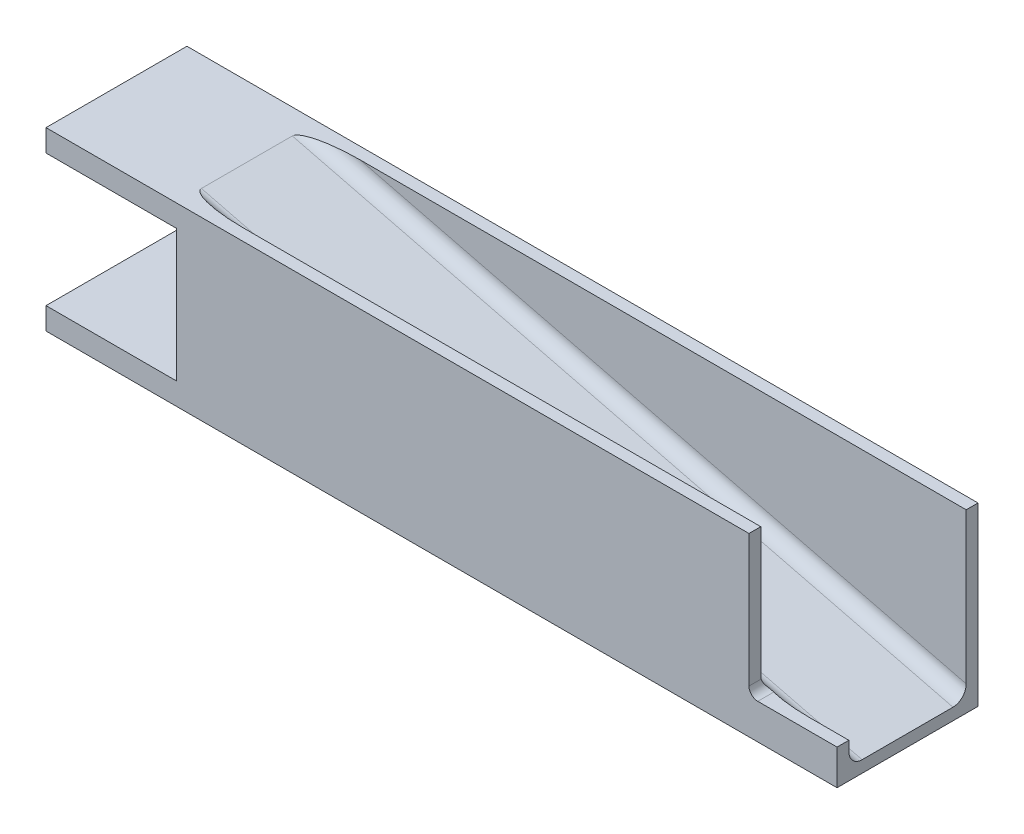
ISO-10303-21;
HEADER;
FILE_DESCRIPTION(('STEP AP214'),'2;1');
FILE_NAME('part.step','',(''),(''),'','','');
FILE_SCHEMA(('AUTOMOTIVE_DESIGN { 1 0 10303 214 1 1 1 1 }'));
ENDSEC;
DATA;
#1=APPLICATION_CONTEXT('core data for automotive mechanical design processes');
#2=APPLICATION_PROTOCOL_DEFINITION('international standard','automotive_design',2000,#1);
#3=PRODUCT_CONTEXT('',#1,'mechanical');
#4=PRODUCT('Part','Part','',(#3));
#5=PRODUCT_RELATED_PRODUCT_CATEGORY('part','',(#4));
#6=PRODUCT_DEFINITION_FORMATION('','',#4);
#7=PRODUCT_DEFINITION_CONTEXT('part definition',#1,'design');
#8=PRODUCT_DEFINITION('design','',#6,#7);
#9=PRODUCT_DEFINITION_SHAPE('','',#8);
#10=(LENGTH_UNIT() NAMED_UNIT(*) SI_UNIT(.MILLI.,.METRE.));
#11=(NAMED_UNIT(*) PLANE_ANGLE_UNIT() SI_UNIT($,.RADIAN.));
#12=(NAMED_UNIT(*) SI_UNIT($,.STERADIAN.) SOLID_ANGLE_UNIT());
#13=UNCERTAINTY_MEASURE_WITH_UNIT(LENGTH_MEASURE(1.E-05),#10,'distance_accuracy_value','');
#14=(GEOMETRIC_REPRESENTATION_CONTEXT(3) GLOBAL_UNCERTAINTY_ASSIGNED_CONTEXT((#13)) GLOBAL_UNIT_ASSIGNED_CONTEXT((#10,
#11,#12)) REPRESENTATION_CONTEXT('',''));
#15=CARTESIAN_POINT('',(0.,0.,0.));
#16=DIRECTION('',(0.,0.,1.));
#17=DIRECTION('',(1.,0.,0.));
#18=AXIS2_PLACEMENT_3D('',#15,#16,#17);
#19=CARTESIAN_POINT('',(0.,50.8,0.));
#20=DIRECTION('',(0.,0.,-1.));
#21=DIRECTION('',(-1.,0.,0.));
#22=AXIS2_PLACEMENT_3D('',#19,#20,#21);
#23=PLANE('',#22);
#24=DIRECTION('',(1.,0.,0.));
#25=VECTOR('',#24,1.);
#26=CARTESIAN_POINT('',(0.,44.45,0.));
#27=LINE('',#26,#25);
#28=CARTESIAN_POINT('',(-37.592,44.45,0.));
#29=VERTEX_POINT('',#28);
#30=CARTESIAN_POINT('',(0.,44.45,0.));
#31=VERTEX_POINT('',#30);
#32=EDGE_CURVE('E177',#29,#31,#27,.T.);
#33=ORIENTED_EDGE('',*,*,#32,.T.);
#34=DIRECTION('',(0.,-1.,0.));
#35=VECTOR('',#34,1.);
#36=CARTESIAN_POINT('',(0.,0.,0.));
#37=LINE('',#36,#35);
#38=CARTESIAN_POINT('',(0.,6.35,0.));
#39=VERTEX_POINT('',#38);
#40=EDGE_CURVE('E192',#31,#39,#37,.T.);
#41=ORIENTED_EDGE('',*,*,#40,.T.);
#42=DIRECTION('',(1.,0.,0.));
#43=VECTOR('',#42,1.);
#44=CARTESIAN_POINT('',(0.,6.35,0.));
#45=LINE('',#44,#43);
#46=CARTESIAN_POINT('',(-37.592,6.35,0.));
#47=VERTEX_POINT('',#46);
#48=EDGE_CURVE('E430',#47,#39,#45,.T.);
#49=ORIENTED_EDGE('',*,*,#48,.F.);
#50=DIRECTION('',(0.,1.,0.));
#51=VECTOR('',#50,1.);
#52=CARTESIAN_POINT('',(-37.592,50.8,0.));
#53=LINE('',#52,#51);
#54=CARTESIAN_POINT('',(-37.592,0.,0.));
#55=VERTEX_POINT('',#54);
#56=EDGE_CURVE('E210',#55,#47,#53,.T.);
#57=ORIENTED_EDGE('',*,*,#56,.F.);
#58=DIRECTION('',(1.,0.,0.));
#59=VECTOR('',#58,1.);
#60=CARTESIAN_POINT('',(0.,0.,0.));
#61=LINE('',#60,#59);
#62=CARTESIAN_POINT('',(190.5,0.,0.));
#63=VERTEX_POINT('',#62);
#64=EDGE_CURVE('E248',#55,#63,#61,.T.);
#65=ORIENTED_EDGE('',*,*,#64,.T.);
#66=DIRECTION('',(0.,-1.,0.));
#67=VECTOR('',#66,1.);
#68=CARTESIAN_POINT('',(190.5,50.8,0.));
#69=LINE('',#68,#67);
#70=CARTESIAN_POINT('',(190.5,10.16,0.));
#71=VERTEX_POINT('',#70);
#72=EDGE_CURVE('E273',#71,#63,#69,.T.);
#73=ORIENTED_EDGE('',*,*,#72,.F.);
#74=DIRECTION('',(1.,0.,0.));
#75=VECTOR('',#74,1.);
#76=CARTESIAN_POINT('',(190.5,10.16,0.));
#77=LINE('',#76,#75);
#78=CARTESIAN_POINT('',(167.64,10.16,0.));
#79=VERTEX_POINT('',#78);
#80=EDGE_CURVE('E219',#79,#71,#77,.T.);
#81=ORIENTED_EDGE('',*,*,#80,.F.);
#82=CARTESIAN_POINT('',(167.64,12.7,0.));
#83=DIRECTION('',(0.,0.,-1.));
#84=DIRECTION('',(-1.,0.,0.));
#85=AXIS2_PLACEMENT_3D('',#82,#83,#84);
#86=CIRCLE('',#85,2.54);
#87=CARTESIAN_POINT('',(165.1,12.7,0.));
#88=VERTEX_POINT('',#87);
#89=EDGE_CURVE('E59',#79,#88,#86,.T.);
#90=ORIENTED_EDGE('',*,*,#89,.T.);
#91=DIRECTION('',(0.,-1.,0.));
#92=VECTOR('',#91,1.);
#93=CARTESIAN_POINT('',(165.1,10.16,0.));
#94=LINE('',#93,#92);
#95=CARTESIAN_POINT('',(165.1,50.8,0.));
#96=VERTEX_POINT('',#95);
#97=EDGE_CURVE('E216',#96,#88,#94,.T.);
#98=ORIENTED_EDGE('',*,*,#97,.F.);
#99=DIRECTION('',(1.,0.,0.));
#100=VECTOR('',#99,1.);
#101=CARTESIAN_POINT('',(0.,50.8,0.));
#102=LINE('',#101,#100);
#103=CARTESIAN_POINT('',(-37.592,50.8,0.));
#104=VERTEX_POINT('',#103);
#105=EDGE_CURVE('E249',#104,#96,#102,.T.);
#106=ORIENTED_EDGE('',*,*,#105,.F.);
#107=EDGE_CURVE('E205',#29,#104,#53,.T.);
#108=ORIENTED_EDGE('',*,*,#107,.F.);
#109=EDGE_LOOP('',(#33,#41,#49,#57,#65,#73,#81,#90,#98,#106,#108));
#110=FACE_BOUND('',#109,.T.);
#111=ADVANCED_FACE('F45',(#110),#23,.F.);
#112=CARTESIAN_POINT('',(0.,50.8,-40.64));
#113=DIRECTION('',(0.,0.,1.));
#114=DIRECTION('',(1.,0.,0.));
#115=AXIS2_PLACEMENT_3D('',#112,#113,#114);
#116=PLANE('',#115);
#117=DIRECTION('',(1.,0.,0.));
#118=VECTOR('',#117,1.);
#119=CARTESIAN_POINT('',(0.,44.45,-40.64));
#120=LINE('',#119,#118);
#121=CARTESIAN_POINT('',(-37.592,44.45,-40.64));
#122=VERTEX_POINT('',#121);
#123=CARTESIAN_POINT('',(0.,44.45,-40.64));
#124=VERTEX_POINT('',#123);
#125=EDGE_CURVE('E174',#122,#124,#120,.T.);
#126=ORIENTED_EDGE('',*,*,#125,.F.);
#127=DIRECTION('',(0.,-1.,0.));
#128=VECTOR('',#127,1.);
#129=CARTESIAN_POINT('',(-37.592,50.8,-40.64));
#130=LINE('',#129,#128);
#131=CARTESIAN_POINT('',(-37.592,50.8,-40.64));
#132=VERTEX_POINT('',#131);
#133=EDGE_CURVE('E190',#132,#122,#130,.T.);
#134=ORIENTED_EDGE('',*,*,#133,.F.);
#135=DIRECTION('',(-1.,0.,0.));
#136=VECTOR('',#135,1.);
#137=CARTESIAN_POINT('',(0.,50.8,-40.64));
#138=LINE('',#137,#136);
#139=CARTESIAN_POINT('',(190.5,50.8,-40.64));
#140=VERTEX_POINT('',#139);
#141=EDGE_CURVE('E257',#140,#132,#138,.T.);
#142=ORIENTED_EDGE('',*,*,#141,.F.);
#143=DIRECTION('',(0.,-1.,0.));
#144=VECTOR('',#143,1.);
#145=CARTESIAN_POINT('',(190.5,50.8,-40.64));
#146=LINE('',#145,#144);
#147=CARTESIAN_POINT('',(190.5,0.,-40.64));
#148=VERTEX_POINT('',#147);
#149=EDGE_CURVE('E260',#140,#148,#146,.T.);
#150=ORIENTED_EDGE('',*,*,#149,.T.);
#151=DIRECTION('',(-1.,0.,0.));
#152=VECTOR('',#151,1.);
#153=CARTESIAN_POINT('',(0.,0.,-40.64));
#154=LINE('',#153,#152);
#155=CARTESIAN_POINT('',(-37.592,0.,-40.64));
#156=VERTEX_POINT('',#155);
#157=EDGE_CURVE('E254',#148,#156,#154,.T.);
#158=ORIENTED_EDGE('',*,*,#157,.T.);
#159=CARTESIAN_POINT('',(-37.592,6.35,-40.64));
#160=VERTEX_POINT('',#159);
#161=EDGE_CURVE('E200',#160,#156,#130,.T.);
#162=ORIENTED_EDGE('',*,*,#161,.F.);
#163=DIRECTION('',(1.,0.,0.));
#164=VECTOR('',#163,1.);
#165=CARTESIAN_POINT('',(0.,6.35,-40.64));
#166=LINE('',#165,#164);
#167=CARTESIAN_POINT('',(0.,6.35,-40.64));
#168=VERTEX_POINT('',#167);
#169=EDGE_CURVE('E66',#160,#168,#166,.T.);
#170=ORIENTED_EDGE('',*,*,#169,.T.);
#171=DIRECTION('',(0.,-1.,0.));
#172=VECTOR('',#171,1.);
#173=CARTESIAN_POINT('',(0.,0.,-40.64));
#174=LINE('',#173,#172);
#175=EDGE_CURVE('E183',#124,#168,#174,.T.);
#176=ORIENTED_EDGE('',*,*,#175,.F.);
#177=EDGE_LOOP('',(#126,#134,#142,#150,#158,#162,#170,#176));
#178=FACE_BOUND('',#177,.T.);
#179=ADVANCED_FACE('F188',(#178),#116,.F.);
#180=CARTESIAN_POINT('',(-37.592,0.,0.));
#181=DIRECTION('',(-1.,0.,0.));
#182=DIRECTION('',(0.,0.,1.));
#183=AXIS2_PLACEMENT_3D('',#180,#181,#182);
#184=PLANE('',#183);
#185=ORIENTED_EDGE('',*,*,#133,.T.);
#186=DIRECTION('',(0.,0.,1.));
#187=VECTOR('',#186,1.);
#188=CARTESIAN_POINT('',(-37.592,44.45,-40.64));
#189=LINE('',#188,#187);
#190=EDGE_CURVE('E170',#122,#29,#189,.T.);
#191=ORIENTED_EDGE('',*,*,#190,.T.);
#192=ORIENTED_EDGE('',*,*,#107,.T.);
#193=DIRECTION('',(0.,0.,-1.));
#194=VECTOR('',#193,1.);
#195=CARTESIAN_POINT('',(-37.592,50.8,-40.64));
#196=LINE('',#195,#194);
#197=EDGE_CURVE('E197',#104,#132,#196,.T.);
#198=ORIENTED_EDGE('',*,*,#197,.T.);
#199=EDGE_LOOP('',(#185,#191,#192,#198));
#200=FACE_BOUND('',#199,.T.);
#201=ADVANCED_FACE('F195',(#200),#184,.T.);
#202=CARTESIAN_POINT('',(0.,3.4036,-3.4036));
#203=DIRECTION('',(0.,0.,1.));
#204=DIRECTION('',(1.,0.,0.));
#205=AXIS2_PLACEMENT_3D('',#202,#203,#204);
#206=PLANE('',#205);
#207=DIRECTION('',(0.970415880831698,-0.241439471150927,0.));
#208=VECTOR('',#207,1.);
#209=CARTESIAN_POINT('',(12.0247043578313,51.7344052967495,-3.4036));
#210=LINE('',#209,#208);
#211=CARTESIAN_POINT('',(190.5,7.32975174097794,-3.4036));
#212=VERTEX_POINT('',#211);
#213=CARTESIAN_POINT('',(179.124404103609,10.16,-3.4036));
#214=VERTEX_POINT('',#213);
#215=EDGE_CURVE('E289',#212,#214,#210,.F.);
#216=ORIENTED_EDGE('',*,*,#215,.T.);
#217=DIRECTION('',(1.,0.,0.));
#218=VECTOR('',#217,1.);
#219=CARTESIAN_POINT('',(0.,10.16,-3.4036));
#220=LINE('',#219,#218);
#221=CARTESIAN_POINT('',(190.5,10.16,-3.4036));
#222=VERTEX_POINT('',#221);
#223=EDGE_CURVE('E233',#214,#222,#220,.T.);
#224=ORIENTED_EDGE('',*,*,#223,.T.);
#225=DIRECTION('',(0.,-1.,0.));
#226=VECTOR('',#225,1.);
#227=CARTESIAN_POINT('',(190.5,3.4036,-3.4036));
#228=LINE('',#227,#226);
#229=EDGE_CURVE('E238',#222,#212,#228,.T.);
#230=ORIENTED_EDGE('',*,*,#229,.T.);
#231=EDGE_LOOP('',(#216,#224,#230));
#232=FACE_BOUND('',#231,.T.);
#233=ADVANCED_FACE('F357',(#232),#206,.F.);
#234=CARTESIAN_POINT('',(190.5,50.8,0.));
#235=DIRECTION('',(-1.,0.,0.));
#236=DIRECTION('',(0.,0.,1.));
#237=AXIS2_PLACEMENT_3D('',#234,#235,#236);
#238=PLANE('',#237);
#239=ORIENTED_EDGE('',*,*,#229,.F.);
#240=DIRECTION('',(0.,0.,1.));
#241=VECTOR('',#240,1.);
#242=CARTESIAN_POINT('',(190.5,10.16,-5.08));
#243=LINE('',#242,#241);
#244=EDGE_CURVE('E223',#222,#71,#243,.T.);
#245=ORIENTED_EDGE('',*,*,#244,.T.);
#246=ORIENTED_EDGE('',*,*,#72,.T.);
#247=DIRECTION('',(0.,0.,-1.));
#248=VECTOR('',#247,1.);
#249=CARTESIAN_POINT('',(190.5,0.,0.));
#250=LINE('',#249,#248);
#251=EDGE_CURVE('E264',#63,#148,#250,.T.);
#252=ORIENTED_EDGE('',*,*,#251,.T.);
#253=ORIENTED_EDGE('',*,*,#149,.F.);
#254=DIRECTION('',(0.,0.,-1.));
#255=VECTOR('',#254,1.);
#256=CARTESIAN_POINT('',(190.5,50.8,0.));
#257=LINE('',#256,#255);
#258=CARTESIAN_POINT('',(190.5,50.8,-37.2364));
#259=VERTEX_POINT('',#258);
#260=EDGE_CURVE('E253',#259,#140,#257,.T.);
#261=ORIENTED_EDGE('',*,*,#260,.F.);
#262=DIRECTION('',(0.,1.,0.));
#263=VECTOR('',#262,1.);
#264=CARTESIAN_POINT('',(190.5,3.4036,-37.2364));
#265=LINE('',#264,#263);
#266=CARTESIAN_POINT('',(190.5,7.32975174097795,-37.2364));
#267=VERTEX_POINT('',#266);
#268=EDGE_CURVE('E245',#267,#259,#265,.T.);
#269=ORIENTED_EDGE('',*,*,#268,.F.);
#270=CARTESIAN_POINT('',(190.5,7.32975174097795,-33.4264));
#271=DIRECTION('',(-1.,0.,0.));
#272=DIRECTION('',(0.,1.,0.));
#273=AXIS2_PLACEMENT_3D('',#270,#271,#272);
#274=ELLIPSE('',#273,3.92615174097793,3.81);
#275=CARTESIAN_POINT('',(190.5,3.4036,-33.4264));
#276=VERTEX_POINT('',#275);
#277=EDGE_CURVE('E294',#267,#276,#274,.T.);
#278=ORIENTED_EDGE('',*,*,#277,.T.);
#279=DIRECTION('',(0.,0.,-1.));
#280=VECTOR('',#279,1.);
#281=CARTESIAN_POINT('',(190.5,3.4036,-3.4036));
#282=LINE('',#281,#280);
#283=CARTESIAN_POINT('',(190.5,3.4036,-7.2136));
#284=VERTEX_POINT('',#283);
#285=EDGE_CURVE('E241',#284,#276,#282,.T.);
#286=ORIENTED_EDGE('',*,*,#285,.F.);
#287=CARTESIAN_POINT('',(190.5,7.32975174097795,-7.2136));
#288=DIRECTION('',(-1.,0.,0.));
#289=DIRECTION('',(0.,-1.,0.));
#290=AXIS2_PLACEMENT_3D('',#287,#288,#289);
#291=ELLIPSE('',#290,3.92615174097793,3.81);
#292=EDGE_CURVE('E297',#284,#212,#291,.T.);
#293=ORIENTED_EDGE('',*,*,#292,.T.);
#294=EDGE_LOOP('',(#239,#245,#246,#252,#253,#261,#269,#278,#286,#293));
#295=FACE_BOUND('',#294,.T.);
#296=ADVANCED_FACE('F365',(#295),#238,.F.);
#297=CARTESIAN_POINT('',(0.,50.8,0.));
#298=DIRECTION('',(0.,-1.,0.));
#299=DIRECTION('',(0.,0.,-1.));
#300=AXIS2_PLACEMENT_3D('',#297,#298,#299);
#301=PLANE('',#300);
#302=ORIENTED_EDGE('',*,*,#141,.T.);
#303=ORIENTED_EDGE('',*,*,#197,.F.);
#304=ORIENTED_EDGE('',*,*,#105,.T.);
#305=DIRECTION('',(0.,0.,1.));
#306=VECTOR('',#305,1.);
#307=CARTESIAN_POINT('',(165.1,50.8,-5.08));
#308=LINE('',#307,#306);
#309=CARTESIAN_POINT('',(165.1,50.8,-3.4036));
#310=VERTEX_POINT('',#309);
#311=EDGE_CURVE('E222',#310,#96,#308,.T.);
#312=ORIENTED_EDGE('',*,*,#311,.F.);
#313=DIRECTION('',(-1.,0.,0.));
#314=VECTOR('',#313,1.);
#315=CARTESIAN_POINT('',(0.,50.8,-3.4036));
#316=LINE('',#315,#314);
#317=CARTESIAN_POINT('',(15.7803526566637,50.8,-3.4036));
#318=VERTEX_POINT('',#317);
#319=EDGE_CURVE('E280',#310,#318,#316,.T.);
#320=ORIENTED_EDGE('',*,*,#319,.T.);
#321=CARTESIAN_POINT('',(15.7803526566638,50.8,-7.2136));
#322=DIRECTION('',(0.,-1.,0.));
#323=DIRECTION('',(1.,0.,0.));
#324=AXIS2_PLACEMENT_3D('',#321,#322,#323);
#325=ELLIPSE('',#324,15.7803526566637,3.81);
#326=CARTESIAN_POINT('',(0.,50.8,-7.2136));
#327=VERTEX_POINT('',#326);
#328=EDGE_CURVE('E301',#318,#327,#325,.T.);
#329=ORIENTED_EDGE('',*,*,#328,.T.);
#330=DIRECTION('',(0.,0.,1.));
#331=VECTOR('',#330,1.);
#332=CARTESIAN_POINT('',(0.,50.8,-37.2364));
#333=LINE('',#332,#331);
#334=CARTESIAN_POINT('',(0.,50.8,-33.4264));
#335=VERTEX_POINT('',#334);
#336=EDGE_CURVE('E237',#335,#327,#333,.T.);
#337=ORIENTED_EDGE('',*,*,#336,.F.);
#338=CARTESIAN_POINT('',(15.7803526566638,50.8,-33.4264));
#339=DIRECTION('',(0.,-1.,0.));
#340=DIRECTION('',(-1.,0.,0.));
#341=AXIS2_PLACEMENT_3D('',#338,#339,#340);
#342=ELLIPSE('',#341,15.7803526566637,3.81);
#343=CARTESIAN_POINT('',(15.7803526566638,50.8,-37.2364));
#344=VERTEX_POINT('',#343);
#345=EDGE_CURVE('E293',#335,#344,#342,.T.);
#346=ORIENTED_EDGE('',*,*,#345,.T.);
#347=DIRECTION('',(1.,0.,0.));
#348=VECTOR('',#347,1.);
#349=CARTESIAN_POINT('',(0.,50.8,-37.2364));
#350=LINE('',#349,#348);
#351=EDGE_CURVE('E276',#344,#259,#350,.T.);
#352=ORIENTED_EDGE('',*,*,#351,.T.);
#353=ORIENTED_EDGE('',*,*,#260,.T.);
#354=EDGE_LOOP('',(#302,#303,#304,#312,#320,#329,#337,#346,#352,#353));
#355=FACE_BOUND('',#354,.T.);
#356=ADVANCED_FACE('F375',(#355),#301,.F.);
#357=CARTESIAN_POINT('',(0.,0.,0.));
#358=DIRECTION('',(0.,-1.,0.));
#359=DIRECTION('',(0.,0.,-1.));
#360=AXIS2_PLACEMENT_3D('',#357,#358,#359);
#361=PLANE('',#360);
#362=ORIENTED_EDGE('',*,*,#64,.F.);
#363=DIRECTION('',(0.,0.,1.));
#364=VECTOR('',#363,1.);
#365=CARTESIAN_POINT('',(-37.592,0.,-40.64));
#366=LINE('',#365,#364);
#367=EDGE_CURVE('E199',#156,#55,#366,.T.);
#368=ORIENTED_EDGE('',*,*,#367,.F.);
#369=ORIENTED_EDGE('',*,*,#157,.F.);
#370=ORIENTED_EDGE('',*,*,#251,.F.);
#371=EDGE_LOOP('',(#362,#368,#369,#370));
#372=FACE_BOUND('',#371,.T.);
#373=ADVANCED_FACE('F387',(#372),#361,.T.);
#374=ORIENTED_EDGE('',*,*,#319,.F.);
#375=DIRECTION('',(0.,-1.,0.));
#376=VECTOR('',#375,1.);
#377=CARTESIAN_POINT('',(165.1,3.4036,-3.4036));
#378=LINE('',#377,#376);
#379=CARTESIAN_POINT('',(165.1,13.6492717409779,-3.4036));
#380=VERTEX_POINT('',#379);
#381=EDGE_CURVE('E227',#310,#380,#378,.T.);
#382=ORIENTED_EDGE('',*,*,#381,.T.);
#383=EDGE_CURVE('E287',#380,#318,#210,.F.);
#384=ORIENTED_EDGE('',*,*,#383,.T.);
#385=EDGE_LOOP('',(#374,#382,#384));
#386=FACE_BOUND('',#385,.T.);
#387=ADVANCED_FACE('F379',(#386),#206,.F.);
#388=CARTESIAN_POINT('',(0.,3.4036,-37.2364));
#389=DIRECTION('',(0.,0.,-1.));
#390=DIRECTION('',(-1.,0.,0.));
#391=AXIS2_PLACEMENT_3D('',#388,#389,#390);
#392=PLANE('',#391);
#393=ORIENTED_EDGE('',*,*,#351,.F.);
#394=DIRECTION('',(-0.970415880831698,0.241439471150927,0.));
#395=VECTOR('',#394,1.);
#396=CARTESIAN_POINT('',(12.0247043578313,51.7344052967495,-37.2364));
#397=LINE('',#396,#395);
#398=EDGE_CURVE('E284',#344,#267,#397,.F.);
#399=ORIENTED_EDGE('',*,*,#398,.T.);
#400=ORIENTED_EDGE('',*,*,#268,.T.);
#401=EDGE_LOOP('',(#393,#399,#400));
#402=FACE_BOUND('',#401,.T.);
#403=ADVANCED_FACE('F377',(#402),#392,.F.);
#404=CARTESIAN_POINT('',(11.9022722108749,47.8387146739343,0.));
#405=DIRECTION('',(0.241439471150927,0.970415880831698,0.));
#406=DIRECTION('',(-0.970415880831698,0.241439471150927,0.));
#407=AXIS2_PLACEMENT_3D('',#404,#405,#406);
#408=PLANE('',#407);
#409=ORIENTED_EDGE('',*,*,#285,.T.);
#410=DIRECTION('',(-0.970415880831698,0.241439471150927,0.));
#411=VECTOR('',#410,1.);
#412=CARTESIAN_POINT('',(11.9022722108749,47.8387146739343,-33.4264));
#413=LINE('',#412,#411);
#414=EDGE_CURVE('E288',#276,#335,#413,.T.);
#415=ORIENTED_EDGE('',*,*,#414,.T.);
#416=ORIENTED_EDGE('',*,*,#336,.T.);
#417=DIRECTION('',(0.970415880831698,-0.241439471150927,0.));
#418=VECTOR('',#417,1.);
#419=CARTESIAN_POINT('',(11.9022722108749,47.8387146739343,-7.2136));
#420=LINE('',#419,#418);
#421=EDGE_CURVE('E283',#327,#284,#420,.T.);
#422=ORIENTED_EDGE('',*,*,#421,.T.);
#423=EDGE_LOOP('',(#409,#415,#416,#422));
#424=FACE_BOUND('',#423,.T.);
#425=ADVANCED_FACE('F363',(#424),#408,.T.);
#426=CARTESIAN_POINT('',(12.8221565959599,51.5359991799031,-33.4264));
#427=DIRECTION('',(-0.970415880831698,0.241439471150927,0.));
#428=DIRECTION('',(-0.241439471150927,-0.970415880831698,0.));
#429=AXIS2_PLACEMENT_3D('',#426,#427,#428);
#430=CYLINDRICAL_SURFACE('',#429,3.81);
#431=ORIENTED_EDGE('',*,*,#277,.F.);
#432=ORIENTED_EDGE('',*,*,#398,.F.);
#433=ORIENTED_EDGE('',*,*,#345,.F.);
#434=ORIENTED_EDGE('',*,*,#414,.F.);
#435=EDGE_LOOP('',(#431,#432,#433,#434));
#436=FACE_BOUND('',#435,.T.);
#437=ADVANCED_FACE('F371',(#436),#430,.F.);
#438=CARTESIAN_POINT('',(12.8221565959599,51.5359991799031,-7.2136));
#439=DIRECTION('',(0.970415880831698,-0.241439471150927,0.));
#440=DIRECTION('',(0.241439471150927,0.970415880831698,0.));
#441=AXIS2_PLACEMENT_3D('',#438,#439,#440);
#442=CYLINDRICAL_SURFACE('',#441,3.81);
#443=CARTESIAN_POINT('',(165.1,13.6492717409779,-7.2136));
#444=DIRECTION('',(-1.,0.,0.));
#445=DIRECTION('',(0.,-1.,0.));
#446=AXIS2_PLACEMENT_3D('',#443,#444,#445);
#447=ELLIPSE('',#446,3.92615174097793,3.81);
#448=CARTESIAN_POINT('',(165.1,12.7,-3.51664017034834));
#449=VERTEX_POINT('',#448);
#450=EDGE_CURVE('E302',#380,#449,#447,.F.);
#451=ORIENTED_EDGE('',*,*,#450,.T.);
#452=CARTESIAN_POINT('',(165.1,12.7,-3.51664017034834));
#453=CARTESIAN_POINT('',(165.099992702897,12.6271526956884,-3.5342420046814));
#454=CARTESIAN_POINT('',(165.10313305003,12.5547983467543,-3.55371470235717));
#455=CARTESIAN_POINT('',(165.115401432674,12.4116502128562,-3.59591673533622));
#456=CARTESIAN_POINT('',(165.124522338668,12.3408546733468,-3.61864216781912));
#457=CARTESIAN_POINT('',(165.148349840918,12.2017823659476,-3.66671534806209));
#458=CARTESIAN_POINT('',(165.16301110852,12.1334899644445,-3.69204063192878));
#459=CARTESIAN_POINT('',(165.197614926582,11.9991664377756,-3.74498000075694));
#460=CARTESIAN_POINT('',(165.217559045212,11.9331359906353,-3.77259476365595));
#461=CARTESIAN_POINT('',(165.284654758976,11.7395087908073,-3.85785596393745));
#462=CARTESIAN_POINT('',(165.339209292055,11.6155945997124,-3.91819818004263));
#463=CARTESIAN_POINT('',(165.466525203299,11.378714488069,-4.04229730043502));
#464=CARTESIAN_POINT('',(165.539358657466,11.2657944248663,-4.10606691804236));
#465=CARTESIAN_POINT('',(165.667480728117,11.0979147702697,-4.20537115430045));
#466=CARTESIAN_POINT('',(165.71701101021,11.0387691184158,-4.24135248220329));
#467=CARTESIAN_POINT('',(165.821710692095,10.9247738821903,-4.31187273231293));
#468=CARTESIAN_POINT('',(165.876881943015,10.8699257185696,-4.34641117575477));
#469=CARTESIAN_POINT('',(166.050630219234,10.7125847290208,-4.44594235879831));
#470=CARTESIAN_POINT('',(166.177874495659,10.6167217545131,-4.50720797120865));
#471=CARTESIAN_POINT('',(166.400076933724,10.4810235573254,-4.58741103571121));
#472=CARTESIAN_POINT('',(166.488074224243,10.4339743884118,-4.61352133779332));
#473=CARTESIAN_POINT('',(166.671200707858,10.3498664561188,-4.65417184892341));
#474=CARTESIAN_POINT('',(166.76631618237,10.3127890776081,-4.66873371683002));
#475=CARTESIAN_POINT('',(166.961983986968,10.249998093919,-4.68406343105374));
#476=CARTESIAN_POINT('',(167.062566096274,10.2243556123322,-4.68474608958765));
#477=CARTESIAN_POINT('',(167.265282398083,10.1856736952819,-4.67195677330635));
#478=CARTESIAN_POINT('',(167.36741701252,10.1726377504929,-4.65848088022696));
#479=CARTESIAN_POINT('',(167.497398904511,10.1638405472446,-4.63356358065438));
#480=CARTESIAN_POINT('',(167.526085965797,10.162393375887,-4.62757158671515));
#481=CARTESIAN_POINT('',(167.583212228453,10.1604754531665,-4.61472102149699));
#482=CARTESIAN_POINT('',(167.611651904532,10.1600019155365,-4.6078649827996));
#483=CARTESIAN_POINT('',(167.64,10.16,-4.60060474675632));
#484=B_SPLINE_CURVE_WITH_KNOTS('',3,(#452,#453,#454,#455,#456,#457,#458,#459,#460,#461,#462,
#463,#464,#465,#466,#467,#468,#469,#470,#471,#472,#473,#474,#475,#476,#477,#478,#479,#480,#481,
#482,#483),.UNSPECIFIED.,.F.,.F.,(4,2,2,2,2,2,2,2,2,2,2,2,2,2,2,4),(0.,0.224681984357097,
0.449096607606782,0.671713588418038,0.894396725393803,1.33726790452359,1.78191359627153,
2.03699134149412,2.29215306276802,2.80009801083592,3.1084463736814,3.41621505859226,
3.72587219905162,4.03561505718718,4.12362496106983,4.21138265270725),.UNSPECIFIED.);
#485=CARTESIAN_POINT('',(167.64,10.16,-4.60060474675633));
#486=VERTEX_POINT('',#485);
#487=EDGE_CURVE('E11',#449,#486,#484,.T.);
#488=ORIENTED_EDGE('',*,*,#487,.T.);
#489=CARTESIAN_POINT('',(179.124404103609,10.16,-7.2136));
#490=DIRECTION('',(0.,-1.,0.));
#491=DIRECTION('',(1.,0.,0.));
#492=AXIS2_PLACEMENT_3D('',#489,#490,#491);
#493=ELLIPSE('',#492,15.7803526566637,3.81);
#494=EDGE_CURVE('E305',#486,#214,#493,.F.);
#495=ORIENTED_EDGE('',*,*,#494,.T.);
#496=ORIENTED_EDGE('',*,*,#215,.F.);
#497=ORIENTED_EDGE('',*,*,#292,.F.);
#498=ORIENTED_EDGE('',*,*,#421,.F.);
#499=ORIENTED_EDGE('',*,*,#328,.F.);
#500=ORIENTED_EDGE('',*,*,#383,.F.);
#501=EDGE_LOOP('',(#451,#488,#495,#496,#497,#498,#499,#500));
#502=FACE_BOUND('',#501,.T.);
#503=ADVANCED_FACE('F349',(#502),#442,.F.);
#504=CARTESIAN_POINT('',(190.5,10.16,-5.08));
#505=DIRECTION('',(0.,-1.,0.));
#506=DIRECTION('',(1.,0.,0.));
#507=AXIS2_PLACEMENT_3D('',#504,#505,#506);
#508=PLANE('',#507);
#509=ORIENTED_EDGE('',*,*,#494,.F.);
#510=DIRECTION('',(0.,0.,1.));
#511=VECTOR('',#510,1.);
#512=CARTESIAN_POINT('',(167.64,10.16,0.));
#513=LINE('',#512,#511);
#514=EDGE_CURVE('E308',#486,#79,#513,.T.);
#515=ORIENTED_EDGE('',*,*,#514,.T.);
#516=ORIENTED_EDGE('',*,*,#80,.T.);
#517=ORIENTED_EDGE('',*,*,#244,.F.);
#518=ORIENTED_EDGE('',*,*,#223,.F.);
#519=EDGE_LOOP('',(#509,#515,#516,#517,#518));
#520=FACE_BOUND('',#519,.T.);
#521=ADVANCED_FACE('F354',(#520),#508,.F.);
#522=CARTESIAN_POINT('',(165.1,10.16,-5.08));
#523=DIRECTION('',(-1.,0.,0.));
#524=DIRECTION('',(0.,0.,1.));
#525=AXIS2_PLACEMENT_3D('',#522,#523,#524);
#526=PLANE('',#525);
#527=ORIENTED_EDGE('',*,*,#97,.T.);
#528=DIRECTION('',(0.,0.,1.));
#529=VECTOR('',#528,1.);
#530=CARTESIAN_POINT('',(165.1,12.7,-5.08));
#531=LINE('',#530,#529);
#532=EDGE_CURVE('E74',#88,#449,#531,.F.);
#533=ORIENTED_EDGE('',*,*,#532,.T.);
#534=ORIENTED_EDGE('',*,*,#450,.F.);
#535=ORIENTED_EDGE('',*,*,#381,.F.);
#536=ORIENTED_EDGE('',*,*,#311,.T.);
#537=EDGE_LOOP('',(#527,#533,#534,#535,#536));
#538=FACE_BOUND('',#537,.T.);
#539=ADVANCED_FACE('F344',(#538),#526,.F.);
#540=DIRECTION('',(0.,0.,1.));
#541=VECTOR('',#540,1.);
#542=CARTESIAN_POINT('',(-37.592,6.35,-40.64));
#543=LINE('',#542,#541);
#544=EDGE_CURVE('E182',#160,#47,#543,.T.);
#545=ORIENTED_EDGE('',*,*,#544,.F.);
#546=ORIENTED_EDGE('',*,*,#161,.T.);
#547=ORIENTED_EDGE('',*,*,#367,.T.);
#548=ORIENTED_EDGE('',*,*,#56,.T.);
#549=EDGE_LOOP('',(#545,#546,#547,#548));
#550=FACE_BOUND('',#549,.T.);
#551=ADVANCED_FACE('F409',(#550),#184,.T.);
#552=CARTESIAN_POINT('',(167.64,12.7,-5.08));
#553=DIRECTION('',(0.,0.,-1.));
#554=DIRECTION('',(-1.,0.,0.));
#555=AXIS2_PLACEMENT_3D('',#552,#553,#554);
#556=CYLINDRICAL_SURFACE('',#555,2.54);
#557=ORIENTED_EDGE('',*,*,#487,.F.);
#558=ORIENTED_EDGE('',*,*,#532,.F.);
#559=ORIENTED_EDGE('',*,*,#89,.F.);
#560=ORIENTED_EDGE('',*,*,#514,.F.);
#561=EDGE_LOOP('',(#557,#558,#559,#560));
#562=FACE_BOUND('',#561,.T.);
#563=ADVANCED_FACE('F47',(#562),#556,.F.);
#564=CARTESIAN_POINT('',(0.,44.45,-40.64));
#565=DIRECTION('',(0.,-1.,0.));
#566=DIRECTION('',(1.,0.,0.));
#567=AXIS2_PLACEMENT_3D('',#564,#565,#566);
#568=PLANE('',#567);
#569=ORIENTED_EDGE('',*,*,#32,.F.);
#570=ORIENTED_EDGE('',*,*,#190,.F.);
#571=ORIENTED_EDGE('',*,*,#125,.T.);
#572=DIRECTION('',(0.,0.,1.));
#573=VECTOR('',#572,1.);
#574=CARTESIAN_POINT('',(0.,44.45,-40.64));
#575=LINE('',#574,#573);
#576=EDGE_CURVE('E207',#124,#31,#575,.T.);
#577=ORIENTED_EDGE('',*,*,#576,.T.);
#578=EDGE_LOOP('',(#569,#570,#571,#577));
#579=FACE_BOUND('',#578,.T.);
#580=ADVANCED_FACE('F172',(#579),#568,.T.);
#581=CARTESIAN_POINT('',(0.,0.,-40.64));
#582=DIRECTION('',(-1.,0.,0.));
#583=DIRECTION('',(0.,0.,1.));
#584=AXIS2_PLACEMENT_3D('',#581,#582,#583);
#585=PLANE('',#584);
#586=ORIENTED_EDGE('',*,*,#40,.F.);
#587=ORIENTED_EDGE('',*,*,#576,.F.);
#588=ORIENTED_EDGE('',*,*,#175,.T.);
#589=DIRECTION('',(0.,0.,1.));
#590=VECTOR('',#589,1.);
#591=CARTESIAN_POINT('',(0.,6.35,-40.64));
#592=LINE('',#591,#590);
#593=EDGE_CURVE('E426',#168,#39,#592,.T.);
#594=ORIENTED_EDGE('',*,*,#593,.T.);
#595=EDGE_LOOP('',(#586,#587,#588,#594));
#596=FACE_BOUND('',#595,.T.);
#597=ADVANCED_FACE('F417',(#596),#585,.T.);
#598=CARTESIAN_POINT('',(0.,6.35,-40.64));
#599=DIRECTION('',(0.,-1.,0.));
#600=DIRECTION('',(0.,0.,-1.));
#601=AXIS2_PLACEMENT_3D('',#598,#599,#600);
#602=PLANE('',#601);
#603=ORIENTED_EDGE('',*,*,#48,.T.);
#604=ORIENTED_EDGE('',*,*,#593,.F.);
#605=ORIENTED_EDGE('',*,*,#169,.F.);
#606=ORIENTED_EDGE('',*,*,#544,.T.);
#607=EDGE_LOOP('',(#603,#604,#605,#606));
#608=FACE_BOUND('',#607,.T.);
#609=ADVANCED_FACE('F418',(#608),#602,.F.);
#610=CLOSED_SHELL('',(#111,#179,#201,#233,#296,#356,#373,#387,#403,#425,#437,#503,#521,#539,
#551,#563,#580,#597,#609));
#611=MANIFOLD_SOLID_BREP('B2',#610);
#612=ADVANCED_BREP_SHAPE_REPRESENTATION('',(#18,#611),#14);
#613=SHAPE_DEFINITION_REPRESENTATION(#9,#612);
ENDSEC;
END-ISO-10303-21;
